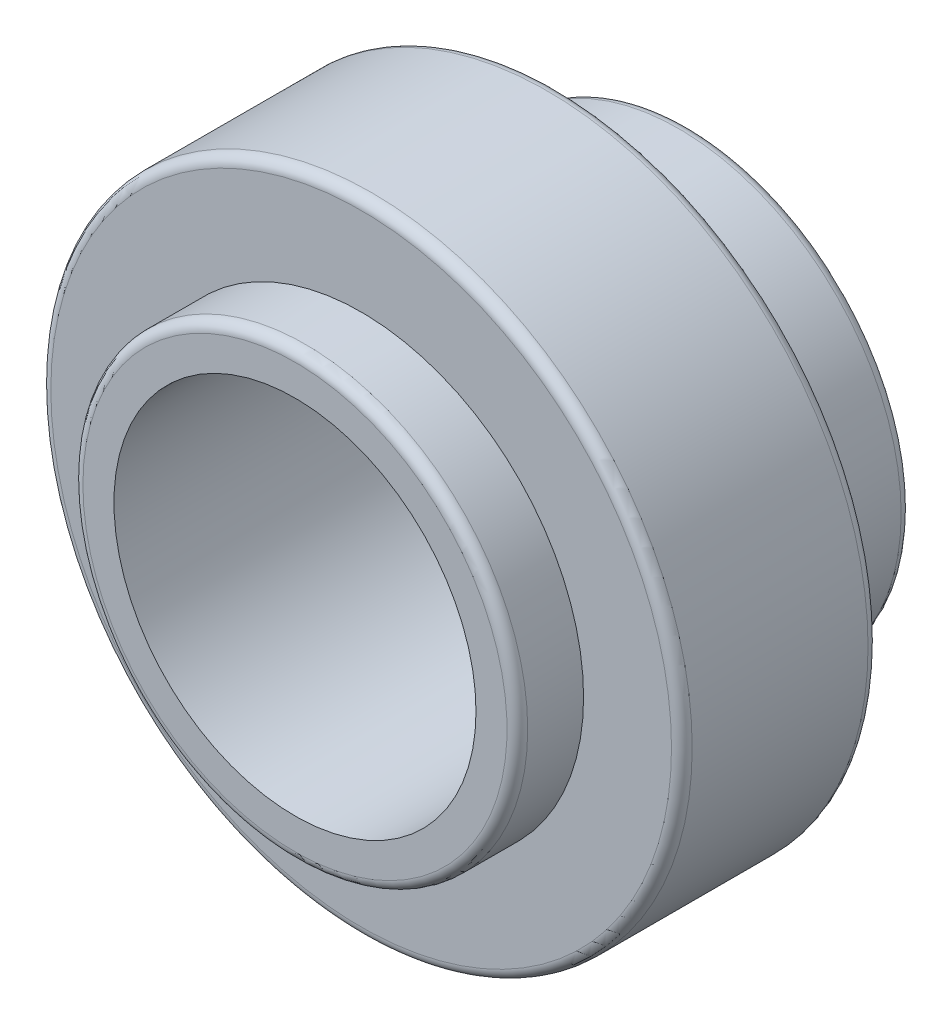
ISO-10303-21;
HEADER;
FILE_DESCRIPTION(('STEP AP214'),'2;1');
FILE_NAME('part.step','',(''),(''),'','','');
FILE_SCHEMA(('AUTOMOTIVE_DESIGN { 1 0 10303 214 1 1 1 1 }'));
ENDSEC;
DATA;
#1=APPLICATION_CONTEXT('core data for automotive mechanical design processes');
#2=APPLICATION_PROTOCOL_DEFINITION('international standard','automotive_design',2000,#1);
#3=PRODUCT_CONTEXT('',#1,'mechanical');
#4=PRODUCT('Part','Part','',(#3));
#5=PRODUCT_RELATED_PRODUCT_CATEGORY('part','',(#4));
#6=PRODUCT_DEFINITION_FORMATION('','',#4);
#7=PRODUCT_DEFINITION_CONTEXT('part definition',#1,'design');
#8=PRODUCT_DEFINITION('design','',#6,#7);
#9=PRODUCT_DEFINITION_SHAPE('','',#8);
#10=(LENGTH_UNIT() NAMED_UNIT(*) SI_UNIT(.MILLI.,.METRE.));
#11=(NAMED_UNIT(*) PLANE_ANGLE_UNIT() SI_UNIT($,.RADIAN.));
#12=(NAMED_UNIT(*) SI_UNIT($,.STERADIAN.) SOLID_ANGLE_UNIT());
#13=UNCERTAINTY_MEASURE_WITH_UNIT(LENGTH_MEASURE(1.E-05),#10,'distance_accuracy_value','');
#14=(GEOMETRIC_REPRESENTATION_CONTEXT(3) GLOBAL_UNCERTAINTY_ASSIGNED_CONTEXT((#13)) GLOBAL_UNIT_ASSIGNED_CONTEXT((#10,
#11,#12)) REPRESENTATION_CONTEXT('',''));
#15=CARTESIAN_POINT('',(0.,0.,0.));
#16=DIRECTION('',(0.,0.,1.));
#17=DIRECTION('',(1.,0.,0.));
#18=AXIS2_PLACEMENT_3D('',#15,#16,#17);
#19=CARTESIAN_POINT('',(0.,0.,23.4705882352941));
#20=DIRECTION('',(0.,0.,1.));
#21=DIRECTION('',(1.,0.,0.));
#22=AXIS2_PLACEMENT_3D('',#19,#20,#21);
#23=CYLINDRICAL_SURFACE('',#22,21.5);
#24=CARTESIAN_POINT('',(0.,0.,14.9));
#25=DIRECTION('',(0.,0.,-1.));
#26=DIRECTION('',(-1.,0.,0.));
#27=AXIS2_PLACEMENT_3D('',#24,#25,#26);
#28=CIRCLE('',#27,21.5);
#29=CARTESIAN_POINT('',(-21.5,0.,14.9));
#30=VERTEX_POINT('',#29);
#31=EDGE_CURVE('E71',#30,#30,#28,.T.);
#32=ORIENTED_EDGE('',*,*,#31,.T.);
#33=EDGE_LOOP('',(#32));
#34=FACE_BOUND('',#33,.T.);
#35=CARTESIAN_POINT('',(0.,0.,9.5));
#36=DIRECTION('',(0.,0.,1.));
#37=DIRECTION('',(1.,0.,0.));
#38=AXIS2_PLACEMENT_3D('',#35,#36,#37);
#39=CIRCLE('',#38,21.5);
#40=CARTESIAN_POINT('',(21.5,0.,9.5));
#41=VERTEX_POINT('',#40);
#42=EDGE_CURVE('E91',#41,#41,#39,.T.);
#43=ORIENTED_EDGE('',*,*,#42,.T.);
#44=EDGE_LOOP('',(#43));
#45=FACE_BOUND('',#44,.T.);
#46=ADVANCED_FACE('F39',(#34,#45),#23,.T.);
#47=CARTESIAN_POINT('',(0.,17.5,15.9));
#48=DIRECTION('',(0.,0.,-1.));
#49=DIRECTION('',(-1.,0.,0.));
#50=AXIS2_PLACEMENT_3D('',#47,#48,#49);
#51=PLANE('',#50);
#52=CARTESIAN_POINT('',(0.,0.,15.9));
#53=DIRECTION('',(0.,0.,-1.));
#54=DIRECTION('',(-1.,0.,0.));
#55=AXIS2_PLACEMENT_3D('',#52,#53,#54);
#56=CIRCLE('',#55,20.5);
#57=CARTESIAN_POINT('',(-20.5,0.,15.9));
#58=VERTEX_POINT('',#57);
#59=EDGE_CURVE('E75',#58,#58,#56,.F.);
#60=ORIENTED_EDGE('',*,*,#59,.T.);
#61=EDGE_LOOP('',(#60));
#62=FACE_BOUND('',#61,.T.);
#63=CARTESIAN_POINT('',(0.,0.,15.9));
#64=DIRECTION('',(0.,0.,1.));
#65=DIRECTION('',(1.,0.,0.));
#66=AXIS2_PLACEMENT_3D('',#63,#64,#65);
#67=CIRCLE('',#66,17.5);
#68=CARTESIAN_POINT('',(17.5,0.,15.9));
#69=VERTEX_POINT('',#68);
#70=EDGE_CURVE('E79',#69,#69,#67,.T.);
#71=ORIENTED_EDGE('',*,*,#70,.F.);
#72=EDGE_LOOP('',(#71));
#73=FACE_BOUND('',#72,.T.);
#74=ADVANCED_FACE('F114',(#62,#73),#51,.F.);
#75=CARTESIAN_POINT('',(0.,0.,23.4705882352941));
#76=DIRECTION('',(0.,0.,1.));
#77=DIRECTION('',(1.,0.,0.));
#78=AXIS2_PLACEMENT_3D('',#75,#76,#77);
#79=CYLINDRICAL_SURFACE('',#78,17.5);
#80=CARTESIAN_POINT('',(0.,0.,-22.2));
#81=DIRECTION('',(0.,0.,1.));
#82=DIRECTION('',(1.,0.,0.));
#83=AXIS2_PLACEMENT_3D('',#80,#81,#82);
#84=CIRCLE('',#83,17.5);
#85=CARTESIAN_POINT('',(17.5,0.,-22.2));
#86=VERTEX_POINT('',#85);
#87=EDGE_CURVE('E83',#86,#86,#84,.T.);
#88=ORIENTED_EDGE('',*,*,#87,.F.);
#89=EDGE_LOOP('',(#88));
#90=FACE_BOUND('',#89,.T.);
#91=ORIENTED_EDGE('',*,*,#70,.T.);
#92=EDGE_LOOP('',(#91));
#93=FACE_BOUND('',#92,.T.);
#94=ADVANCED_FACE('F120',(#90,#93),#79,.F.);
#95=CARTESIAN_POINT('',(0.,21.5,-22.2));
#96=DIRECTION('',(0.,0.,1.));
#97=DIRECTION('',(1.,0.,0.));
#98=AXIS2_PLACEMENT_3D('',#95,#96,#97);
#99=PLANE('',#98);
#100=CARTESIAN_POINT('',(0.,0.,-22.2));
#101=DIRECTION('',(0.,0.,1.));
#102=DIRECTION('',(1.,0.,0.));
#103=AXIS2_PLACEMENT_3D('',#100,#101,#102);
#104=CIRCLE('',#103,20.5);
#105=CARTESIAN_POINT('',(20.5,0.,-22.2));
#106=VERTEX_POINT('',#105);
#107=EDGE_CURVE('E10',#106,#106,#104,.F.);
#108=ORIENTED_EDGE('',*,*,#107,.T.);
#109=EDGE_LOOP('',(#108));
#110=FACE_BOUND('',#109,.T.);
#111=ORIENTED_EDGE('',*,*,#87,.T.);
#112=EDGE_LOOP('',(#111));
#113=FACE_BOUND('',#112,.T.);
#114=ADVANCED_FACE('F146',(#110,#113),#99,.F.);
#115=CARTESIAN_POINT('',(0.,0.,23.4705882352941));
#116=DIRECTION('',(0.,0.,1.));
#117=DIRECTION('',(1.,0.,0.));
#118=AXIS2_PLACEMENT_3D('',#115,#116,#117);
#119=CYLINDRICAL_SURFACE('',#118,21.5);
#120=CARTESIAN_POINT('',(0.,0.,-21.2));
#121=DIRECTION('',(0.,0.,1.));
#122=DIRECTION('',(1.,0.,0.));
#123=AXIS2_PLACEMENT_3D('',#120,#121,#122);
#124=CIRCLE('',#123,21.5);
#125=CARTESIAN_POINT('',(21.5,0.,-21.2));
#126=VERTEX_POINT('',#125);
#127=EDGE_CURVE('E47',#126,#126,#124,.T.);
#128=ORIENTED_EDGE('',*,*,#127,.T.);
#129=EDGE_LOOP('',(#128));
#130=FACE_BOUND('',#129,.T.);
#131=CARTESIAN_POINT('',(0.,0.,-9.5));
#132=DIRECTION('',(0.,0.,1.));
#133=DIRECTION('',(1.,0.,0.));
#134=AXIS2_PLACEMENT_3D('',#131,#132,#133);
#135=CIRCLE('',#134,21.5);
#136=CARTESIAN_POINT('',(21.5,0.,-9.5));
#137=VERTEX_POINT('',#136);
#138=EDGE_CURVE('E87',#137,#137,#135,.T.);
#139=ORIENTED_EDGE('',*,*,#138,.F.);
#140=EDGE_LOOP('',(#139));
#141=FACE_BOUND('',#140,.T.);
#142=ADVANCED_FACE('F141',(#130,#141),#119,.T.);
#143=CARTESIAN_POINT('',(0.,31.,-9.5));
#144=DIRECTION('',(0.,0.,1.));
#145=DIRECTION('',(1.,0.,0.));
#146=AXIS2_PLACEMENT_3D('',#143,#144,#145);
#147=PLANE('',#146);
#148=CARTESIAN_POINT('',(0.,0.,-9.5));
#149=DIRECTION('',(0.,0.,1.));
#150=DIRECTION('',(1.,0.,0.));
#151=AXIS2_PLACEMENT_3D('',#148,#149,#150);
#152=CIRCLE('',#151,30.);
#153=CARTESIAN_POINT('',(30.,0.,-9.5));
#154=VERTEX_POINT('',#153);
#155=EDGE_CURVE('E52',#154,#154,#152,.F.);
#156=ORIENTED_EDGE('',*,*,#155,.T.);
#157=EDGE_LOOP('',(#156));
#158=FACE_BOUND('',#157,.T.);
#159=ORIENTED_EDGE('',*,*,#138,.T.);
#160=EDGE_LOOP('',(#159));
#161=FACE_BOUND('',#160,.T.);
#162=ADVANCED_FACE('F110',(#158,#161),#147,.F.);
#163=CARTESIAN_POINT('',(0.,0.,23.4705882352941));
#164=DIRECTION('',(0.,0.,1.));
#165=DIRECTION('',(1.,0.,0.));
#166=AXIS2_PLACEMENT_3D('',#163,#164,#165);
#167=CYLINDRICAL_SURFACE('',#166,31.);
#168=CARTESIAN_POINT('',(0.,0.,8.5));
#169=DIRECTION('',(0.,0.,-1.));
#170=DIRECTION('',(-1.,0.,0.));
#171=AXIS2_PLACEMENT_3D('',#168,#169,#170);
#172=CIRCLE('',#171,31.);
#173=CARTESIAN_POINT('',(-31.,0.,8.5));
#174=VERTEX_POINT('',#173);
#175=EDGE_CURVE('E57',#174,#174,#172,.T.);
#176=ORIENTED_EDGE('',*,*,#175,.T.);
#177=EDGE_LOOP('',(#176));
#178=FACE_BOUND('',#177,.T.);
#179=CARTESIAN_POINT('',(0.,0.,-8.5));
#180=DIRECTION('',(0.,0.,1.));
#181=DIRECTION('',(1.,0.,0.));
#182=AXIS2_PLACEMENT_3D('',#179,#180,#181);
#183=CIRCLE('',#182,31.);
#184=CARTESIAN_POINT('',(31.,0.,-8.5));
#185=VERTEX_POINT('',#184);
#186=EDGE_CURVE('E63',#185,#185,#183,.T.);
#187=ORIENTED_EDGE('',*,*,#186,.T.);
#188=EDGE_LOOP('',(#187));
#189=FACE_BOUND('',#188,.T.);
#190=ADVANCED_FACE('F100',(#178,#189),#167,.T.);
#191=CARTESIAN_POINT('',(0.,21.5,9.5));
#192=DIRECTION('',(0.,0.,-1.));
#193=DIRECTION('',(-1.,0.,0.));
#194=AXIS2_PLACEMENT_3D('',#191,#192,#193);
#195=PLANE('',#194);
#196=CARTESIAN_POINT('',(0.,0.,9.5));
#197=DIRECTION('',(0.,0.,-1.));
#198=DIRECTION('',(-1.,0.,0.));
#199=AXIS2_PLACEMENT_3D('',#196,#197,#198);
#200=CIRCLE('',#199,30.);
#201=CARTESIAN_POINT('',(-30.,0.,9.5));
#202=VERTEX_POINT('',#201);
#203=EDGE_CURVE('E67',#202,#202,#200,.F.);
#204=ORIENTED_EDGE('',*,*,#203,.T.);
#205=EDGE_LOOP('',(#204));
#206=FACE_BOUND('',#205,.T.);
#207=ORIENTED_EDGE('',*,*,#42,.F.);
#208=EDGE_LOOP('',(#207));
#209=FACE_BOUND('',#208,.T.);
#210=ADVANCED_FACE('F97',(#206,#209),#195,.F.);
#211=CARTESIAN_POINT('',(0.,0.,14.9));
#212=DIRECTION('',(0.,0.,-1.));
#213=DIRECTION('',(-1.,0.,0.));
#214=AXIS2_PLACEMENT_3D('',#211,#212,#213);
#215=TOROIDAL_SURFACE('',#214,20.5,1.);
#216=ORIENTED_EDGE('',*,*,#31,.F.);
#217=EDGE_LOOP('',(#216));
#218=FACE_BOUND('',#217,.T.);
#219=ORIENTED_EDGE('',*,*,#59,.F.);
#220=EDGE_LOOP('',(#219));
#221=FACE_BOUND('',#220,.T.);
#222=ADVANCED_FACE('F99',(#218,#221),#215,.T.);
#223=CARTESIAN_POINT('',(0.,0.,8.5));
#224=DIRECTION('',(0.,0.,-1.));
#225=DIRECTION('',(-1.,0.,0.));
#226=AXIS2_PLACEMENT_3D('',#223,#224,#225);
#227=TOROIDAL_SURFACE('',#226,30.,1.);
#228=ORIENTED_EDGE('',*,*,#175,.F.);
#229=EDGE_LOOP('',(#228));
#230=FACE_BOUND('',#229,.T.);
#231=ORIENTED_EDGE('',*,*,#203,.F.);
#232=EDGE_LOOP('',(#231));
#233=FACE_BOUND('',#232,.T.);
#234=ADVANCED_FACE('F107',(#230,#233),#227,.T.);
#235=CARTESIAN_POINT('',(0.,0.,-8.5));
#236=DIRECTION('',(0.,0.,1.));
#237=DIRECTION('',(1.,0.,0.));
#238=AXIS2_PLACEMENT_3D('',#235,#236,#237);
#239=TOROIDAL_SURFACE('',#238,30.,1.);
#240=ORIENTED_EDGE('',*,*,#155,.F.);
#241=EDGE_LOOP('',(#240));
#242=FACE_BOUND('',#241,.T.);
#243=ORIENTED_EDGE('',*,*,#186,.F.);
#244=EDGE_LOOP('',(#243));
#245=FACE_BOUND('',#244,.T.);
#246=ADVANCED_FACE('F126',(#242,#245),#239,.T.);
#247=CARTESIAN_POINT('',(0.,0.,-21.2));
#248=DIRECTION('',(0.,0.,1.));
#249=DIRECTION('',(1.,0.,0.));
#250=AXIS2_PLACEMENT_3D('',#247,#248,#249);
#251=TOROIDAL_SURFACE('',#250,20.5,1.);
#252=ORIENTED_EDGE('',*,*,#107,.F.);
#253=EDGE_LOOP('',(#252));
#254=FACE_BOUND('',#253,.T.);
#255=ORIENTED_EDGE('',*,*,#127,.F.);
#256=EDGE_LOOP('',(#255));
#257=FACE_BOUND('',#256,.T.);
#258=ADVANCED_FACE('F41',(#254,#257),#251,.T.);
#259=CLOSED_SHELL('',(#46,#74,#94,#114,#142,#162,#190,#210,#222,#234,#246,#258));
#260=MANIFOLD_SOLID_BREP('B2',#259);
#261=ADVANCED_BREP_SHAPE_REPRESENTATION('',(#18,#260),#14);
#262=SHAPE_DEFINITION_REPRESENTATION(#9,#261);
ENDSEC;
END-ISO-10303-21;
